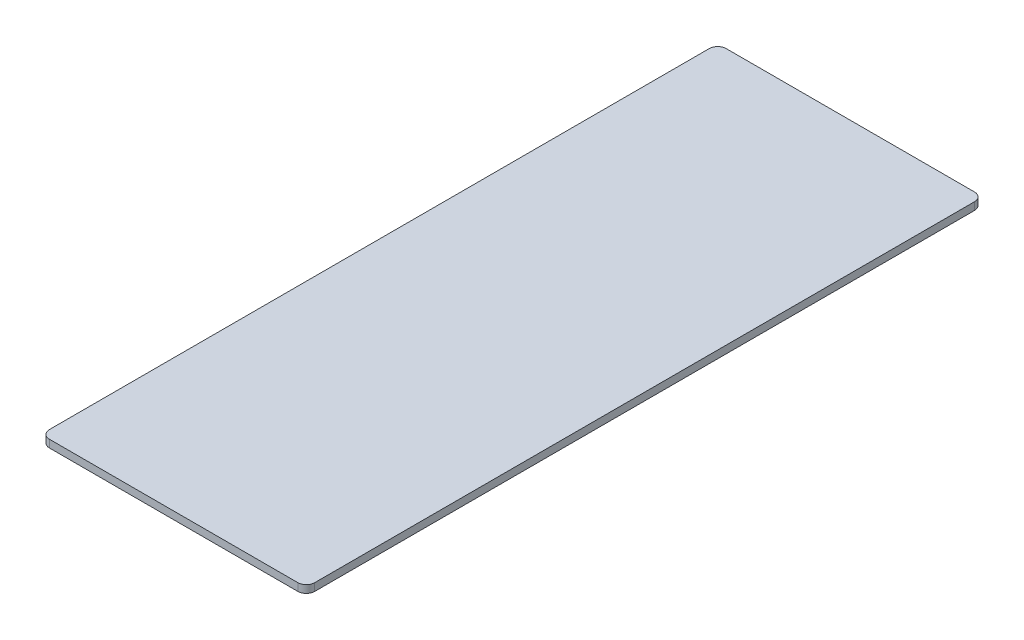
ISO-10303-21;
HEADER;
FILE_DESCRIPTION(('STEP AP214'),'2;1');
FILE_NAME('part.step','',(''),(''),'','','');
FILE_SCHEMA(('AUTOMOTIVE_DESIGN { 1 0 10303 214 1 1 1 1 }'));
ENDSEC;
DATA;
#1=APPLICATION_CONTEXT('core data for automotive mechanical design processes');
#2=APPLICATION_PROTOCOL_DEFINITION('international standard','automotive_design',2000,#1);
#3=PRODUCT_CONTEXT('',#1,'mechanical');
#4=PRODUCT('Part','Part','',(#3));
#5=PRODUCT_RELATED_PRODUCT_CATEGORY('part','',(#4));
#6=PRODUCT_DEFINITION_FORMATION('','',#4);
#7=PRODUCT_DEFINITION_CONTEXT('part definition',#1,'design');
#8=PRODUCT_DEFINITION('design','',#6,#7);
#9=PRODUCT_DEFINITION_SHAPE('','',#8);
#10=(LENGTH_UNIT() NAMED_UNIT(*) SI_UNIT(.MILLI.,.METRE.));
#11=(NAMED_UNIT(*) PLANE_ANGLE_UNIT() SI_UNIT($,.RADIAN.));
#12=(NAMED_UNIT(*) SI_UNIT($,.STERADIAN.) SOLID_ANGLE_UNIT());
#13=UNCERTAINTY_MEASURE_WITH_UNIT(LENGTH_MEASURE(1.E-05),#10,'distance_accuracy_value','');
#14=(GEOMETRIC_REPRESENTATION_CONTEXT(3) GLOBAL_UNCERTAINTY_ASSIGNED_CONTEXT((#13)) GLOBAL_UNIT_ASSIGNED_CONTEXT((#10,
#11,#12)) REPRESENTATION_CONTEXT('',''));
#15=CARTESIAN_POINT('',(0.,0.,0.));
#16=DIRECTION('',(0.,0.,1.));
#17=DIRECTION('',(1.,0.,0.));
#18=AXIS2_PLACEMENT_3D('',#15,#16,#17);
#19=CARTESIAN_POINT('',(0.,4.5,0.));
#20=DIRECTION('',(1.,0.,0.));
#21=DIRECTION('',(0.,0.,-1.));
#22=AXIS2_PLACEMENT_3D('',#19,#20,#21);
#23=PLANE('',#22);
#24=DIRECTION('',(0.,0.,1.));
#25=VECTOR('',#24,1.);
#26=CARTESIAN_POINT('',(0.,4.5,0.));
#27=LINE('',#26,#25);
#28=CARTESIAN_POINT('',(0.,4.5,-395.));
#29=VERTEX_POINT('',#28);
#30=CARTESIAN_POINT('',(0.,4.5,-5.));
#31=VERTEX_POINT('',#30);
#32=EDGE_CURVE('E131',#29,#31,#27,.T.);
#33=ORIENTED_EDGE('',*,*,#32,.F.);
#34=DIRECTION('',(0.,-1.,0.));
#35=VECTOR('',#34,1.);
#36=CARTESIAN_POINT('',(0.,4.5,-395.));
#37=LINE('',#36,#35);
#38=CARTESIAN_POINT('',(0.,0.,-395.));
#39=VERTEX_POINT('',#38);
#40=EDGE_CURVE('E115',#29,#39,#37,.T.);
#41=ORIENTED_EDGE('',*,*,#40,.T.);
#42=DIRECTION('',(0.,0.,1.));
#43=VECTOR('',#42,1.);
#44=CARTESIAN_POINT('',(0.,0.,0.));
#45=LINE('',#44,#43);
#46=CARTESIAN_POINT('',(0.,0.,-5.));
#47=VERTEX_POINT('',#46);
#48=EDGE_CURVE('E128',#39,#47,#45,.T.);
#49=ORIENTED_EDGE('',*,*,#48,.T.);
#50=DIRECTION('',(0.,-1.,0.));
#51=VECTOR('',#50,1.);
#52=CARTESIAN_POINT('',(0.,4.5,-5.));
#53=LINE('',#52,#51);
#54=EDGE_CURVE('E134',#47,#31,#53,.F.);
#55=ORIENTED_EDGE('',*,*,#54,.T.);
#56=EDGE_LOOP('',(#33,#41,#49,#55));
#57=FACE_BOUND('',#56,.T.);
#58=ADVANCED_FACE('F45',(#57),#23,.F.);
#59=CARTESIAN_POINT('',(0.,4.5,0.));
#60=DIRECTION('',(0.,0.,-1.));
#61=DIRECTION('',(-1.,0.,0.));
#62=AXIS2_PLACEMENT_3D('',#59,#60,#61);
#63=PLANE('',#62);
#64=DIRECTION('',(1.,0.,0.));
#65=VECTOR('',#64,1.);
#66=CARTESIAN_POINT('',(0.,4.5,0.));
#67=LINE('',#66,#65);
#68=CARTESIAN_POINT('',(5.,4.5,0.));
#69=VERTEX_POINT('',#68);
#70=CARTESIAN_POINT('',(151.8,4.5,0.));
#71=VERTEX_POINT('',#70);
#72=EDGE_CURVE('E202',#69,#71,#67,.T.);
#73=ORIENTED_EDGE('',*,*,#72,.F.);
#74=DIRECTION('',(0.,-1.,0.));
#75=VECTOR('',#74,1.);
#76=CARTESIAN_POINT('',(5.,4.5,0.));
#77=LINE('',#76,#75);
#78=CARTESIAN_POINT('',(5.,0.,0.));
#79=VERTEX_POINT('',#78);
#80=EDGE_CURVE('E182',#69,#79,#77,.T.);
#81=ORIENTED_EDGE('',*,*,#80,.T.);
#82=DIRECTION('',(1.,0.,0.));
#83=VECTOR('',#82,1.);
#84=CARTESIAN_POINT('',(0.,0.,0.));
#85=LINE('',#84,#83);
#86=CARTESIAN_POINT('',(151.8,0.,0.));
#87=VERTEX_POINT('',#86);
#88=EDGE_CURVE('E139',#79,#87,#85,.T.);
#89=ORIENTED_EDGE('',*,*,#88,.T.);
#90=DIRECTION('',(0.,-1.,0.));
#91=VECTOR('',#90,1.);
#92=CARTESIAN_POINT('',(151.8,4.5,0.));
#93=LINE('',#92,#91);
#94=EDGE_CURVE('E179',#87,#71,#93,.F.);
#95=ORIENTED_EDGE('',*,*,#94,.T.);
#96=EDGE_LOOP('',(#73,#81,#89,#95));
#97=FACE_BOUND('',#96,.T.);
#98=ADVANCED_FACE('F214',(#97),#63,.F.);
#99=CARTESIAN_POINT('',(156.8,4.5,0.));
#100=DIRECTION('',(-1.,0.,0.));
#101=DIRECTION('',(0.,0.,1.));
#102=AXIS2_PLACEMENT_3D('',#99,#100,#101);
#103=PLANE('',#102);
#104=DIRECTION('',(0.,0.,-1.));
#105=VECTOR('',#104,1.);
#106=CARTESIAN_POINT('',(156.8,0.,0.));
#107=LINE('',#106,#105);
#108=CARTESIAN_POINT('',(156.8,0.,-5.));
#109=VERTEX_POINT('',#108);
#110=CARTESIAN_POINT('',(156.8,0.,-395.));
#111=VERTEX_POINT('',#110);
#112=EDGE_CURVE('E143',#109,#111,#107,.T.);
#113=ORIENTED_EDGE('',*,*,#112,.T.);
#114=DIRECTION('',(0.,-1.,0.));
#115=VECTOR('',#114,1.);
#116=CARTESIAN_POINT('',(156.8,4.5,-395.));
#117=LINE('',#116,#115);
#118=CARTESIAN_POINT('',(156.8,4.5,-395.));
#119=VERTEX_POINT('',#118);
#120=EDGE_CURVE('E11',#111,#119,#117,.F.);
#121=ORIENTED_EDGE('',*,*,#120,.T.);
#122=DIRECTION('',(0.,0.,-1.));
#123=VECTOR('',#122,1.);
#124=CARTESIAN_POINT('',(156.8,4.5,0.));
#125=LINE('',#124,#123);
#126=CARTESIAN_POINT('',(156.8,4.5,-5.));
#127=VERTEX_POINT('',#126);
#128=EDGE_CURVE('E190',#127,#119,#125,.T.);
#129=ORIENTED_EDGE('',*,*,#128,.F.);
#130=DIRECTION('',(0.,-1.,0.));
#131=VECTOR('',#130,1.);
#132=CARTESIAN_POINT('',(156.8,4.5,-5.));
#133=LINE('',#132,#131);
#134=EDGE_CURVE('E54',#127,#109,#133,.T.);
#135=ORIENTED_EDGE('',*,*,#134,.T.);
#136=EDGE_LOOP('',(#113,#121,#129,#135));
#137=FACE_BOUND('',#136,.T.);
#138=ADVANCED_FACE('F189',(#137),#103,.F.);
#139=CARTESIAN_POINT('',(0.,4.5,-400.));
#140=DIRECTION('',(0.,0.,1.));
#141=DIRECTION('',(1.,0.,0.));
#142=AXIS2_PLACEMENT_3D('',#139,#140,#141);
#143=PLANE('',#142);
#144=DIRECTION('',(-1.,0.,0.));
#145=VECTOR('',#144,1.);
#146=CARTESIAN_POINT('',(0.,0.,-400.));
#147=LINE('',#146,#145);
#148=CARTESIAN_POINT('',(151.8,0.,-400.));
#149=VERTEX_POINT('',#148);
#150=CARTESIAN_POINT('',(5.,0.,-400.));
#151=VERTEX_POINT('',#150);
#152=EDGE_CURVE('E151',#149,#151,#147,.T.);
#153=ORIENTED_EDGE('',*,*,#152,.T.);
#154=DIRECTION('',(0.,-1.,0.));
#155=VECTOR('',#154,1.);
#156=CARTESIAN_POINT('',(5.,4.5,-400.));
#157=LINE('',#156,#155);
#158=CARTESIAN_POINT('',(5.,4.5,-400.));
#159=VERTEX_POINT('',#158);
#160=EDGE_CURVE('E116',#151,#159,#157,.F.);
#161=ORIENTED_EDGE('',*,*,#160,.T.);
#162=DIRECTION('',(-1.,0.,0.));
#163=VECTOR('',#162,1.);
#164=CARTESIAN_POINT('',(0.,4.5,-400.));
#165=LINE('',#164,#163);
#166=CARTESIAN_POINT('',(151.8,4.5,-400.));
#167=VERTEX_POINT('',#166);
#168=EDGE_CURVE('E146',#167,#159,#165,.T.);
#169=ORIENTED_EDGE('',*,*,#168,.F.);
#170=DIRECTION('',(0.,-1.,0.));
#171=VECTOR('',#170,1.);
#172=CARTESIAN_POINT('',(151.8,4.5,-400.));
#173=LINE('',#172,#171);
#174=EDGE_CURVE('E122',#167,#149,#173,.T.);
#175=ORIENTED_EDGE('',*,*,#174,.T.);
#176=EDGE_LOOP('',(#153,#161,#169,#175));
#177=FACE_BOUND('',#176,.T.);
#178=ADVANCED_FACE('F198',(#177),#143,.F.);
#179=CARTESIAN_POINT('',(0.,4.5,0.));
#180=DIRECTION('',(0.,-1.,0.));
#181=DIRECTION('',(0.,0.,-1.));
#182=AXIS2_PLACEMENT_3D('',#179,#180,#181);
#183=PLANE('',#182);
#184=ORIENTED_EDGE('',*,*,#168,.T.);
#185=CARTESIAN_POINT('',(5.,4.5,-395.));
#186=DIRECTION('',(0.,-1.,0.));
#187=DIRECTION('',(0.,0.,-1.));
#188=AXIS2_PLACEMENT_3D('',#185,#186,#187);
#189=CIRCLE('',#188,5.);
#190=EDGE_CURVE('E176',#159,#29,#189,.F.);
#191=ORIENTED_EDGE('',*,*,#190,.T.);
#192=ORIENTED_EDGE('',*,*,#32,.T.);
#193=CARTESIAN_POINT('',(5.,4.5,-5.));
#194=DIRECTION('',(0.,-1.,0.));
#195=DIRECTION('',(0.,0.,-1.));
#196=AXIS2_PLACEMENT_3D('',#193,#194,#195);
#197=CIRCLE('',#196,5.);
#198=EDGE_CURVE('E173',#31,#69,#197,.F.);
#199=ORIENTED_EDGE('',*,*,#198,.T.);
#200=ORIENTED_EDGE('',*,*,#72,.T.);
#201=CARTESIAN_POINT('',(151.8,4.5,-5.));
#202=DIRECTION('',(0.,-1.,0.));
#203=DIRECTION('',(0.,0.,-1.));
#204=AXIS2_PLACEMENT_3D('',#201,#202,#203);
#205=CIRCLE('',#204,5.);
#206=EDGE_CURVE('E66',#71,#127,#205,.F.);
#207=ORIENTED_EDGE('',*,*,#206,.T.);
#208=ORIENTED_EDGE('',*,*,#128,.T.);
#209=CARTESIAN_POINT('',(151.8,4.5,-395.));
#210=DIRECTION('',(0.,-1.,0.));
#211=DIRECTION('',(0.,0.,-1.));
#212=AXIS2_PLACEMENT_3D('',#209,#210,#211);
#213=CIRCLE('',#212,5.);
#214=EDGE_CURVE('E170',#119,#167,#213,.F.);
#215=ORIENTED_EDGE('',*,*,#214,.T.);
#216=EDGE_LOOP('',(#184,#191,#192,#199,#200,#207,#208,#215));
#217=FACE_BOUND('',#216,.T.);
#218=ADVANCED_FACE('F208',(#217),#183,.F.);
#219=CARTESIAN_POINT('',(0.,0.,0.));
#220=DIRECTION('',(0.,-1.,0.));
#221=DIRECTION('',(0.,0.,-1.));
#222=AXIS2_PLACEMENT_3D('',#219,#220,#221);
#223=PLANE('',#222);
#224=ORIENTED_EDGE('',*,*,#48,.F.);
#225=CARTESIAN_POINT('',(5.,0.,-395.));
#226=DIRECTION('',(0.,-1.,0.));
#227=DIRECTION('',(0.,0.,-1.));
#228=AXIS2_PLACEMENT_3D('',#225,#226,#227);
#229=CIRCLE('',#228,5.);
#230=EDGE_CURVE('E111',#39,#151,#229,.T.);
#231=ORIENTED_EDGE('',*,*,#230,.T.);
#232=ORIENTED_EDGE('',*,*,#152,.F.);
#233=CARTESIAN_POINT('',(151.8,0.,-395.));
#234=DIRECTION('',(0.,-1.,0.));
#235=DIRECTION('',(0.,0.,-1.));
#236=AXIS2_PLACEMENT_3D('',#233,#234,#235);
#237=CIRCLE('',#236,5.);
#238=EDGE_CURVE('E158',#149,#111,#237,.T.);
#239=ORIENTED_EDGE('',*,*,#238,.T.);
#240=ORIENTED_EDGE('',*,*,#112,.F.);
#241=CARTESIAN_POINT('',(151.8,0.,-5.));
#242=DIRECTION('',(0.,-1.,0.));
#243=DIRECTION('',(0.,0.,-1.));
#244=AXIS2_PLACEMENT_3D('',#241,#242,#243);
#245=CIRCLE('',#244,5.);
#246=EDGE_CURVE('E133',#109,#87,#245,.T.);
#247=ORIENTED_EDGE('',*,*,#246,.T.);
#248=ORIENTED_EDGE('',*,*,#88,.F.);
#249=CARTESIAN_POINT('',(5.,0.,-5.));
#250=DIRECTION('',(0.,-1.,0.));
#251=DIRECTION('',(0.,0.,-1.));
#252=AXIS2_PLACEMENT_3D('',#249,#250,#251);
#253=CIRCLE('',#252,5.);
#254=EDGE_CURVE('E123',#79,#47,#253,.T.);
#255=ORIENTED_EDGE('',*,*,#254,.T.);
#256=EDGE_LOOP('',(#224,#231,#232,#239,#240,#247,#248,#255));
#257=FACE_BOUND('',#256,.T.);
#258=ADVANCED_FACE('F136',(#257),#223,.T.);
#259=CARTESIAN_POINT('',(5.,4.5,-395.));
#260=DIRECTION('',(0.,-1.,0.));
#261=DIRECTION('',(0.,0.,-1.));
#262=AXIS2_PLACEMENT_3D('',#259,#260,#261);
#263=CYLINDRICAL_SURFACE('',#262,5.);
#264=ORIENTED_EDGE('',*,*,#190,.F.);
#265=ORIENTED_EDGE('',*,*,#160,.F.);
#266=ORIENTED_EDGE('',*,*,#230,.F.);
#267=ORIENTED_EDGE('',*,*,#40,.F.);
#268=EDGE_LOOP('',(#264,#265,#266,#267));
#269=FACE_BOUND('',#268,.T.);
#270=ADVANCED_FACE('F114',(#269),#263,.T.);
#271=CARTESIAN_POINT('',(5.,4.5,-5.));
#272=DIRECTION('',(0.,-1.,0.));
#273=DIRECTION('',(0.,0.,-1.));
#274=AXIS2_PLACEMENT_3D('',#271,#272,#273);
#275=CYLINDRICAL_SURFACE('',#274,5.);
#276=ORIENTED_EDGE('',*,*,#198,.F.);
#277=ORIENTED_EDGE('',*,*,#54,.F.);
#278=ORIENTED_EDGE('',*,*,#254,.F.);
#279=ORIENTED_EDGE('',*,*,#80,.F.);
#280=EDGE_LOOP('',(#276,#277,#278,#279));
#281=FACE_BOUND('',#280,.T.);
#282=ADVANCED_FACE('F212',(#281),#275,.T.);
#283=CARTESIAN_POINT('',(151.8,4.5,-395.));
#284=DIRECTION('',(0.,-1.,0.));
#285=DIRECTION('',(0.,0.,-1.));
#286=AXIS2_PLACEMENT_3D('',#283,#284,#285);
#287=CYLINDRICAL_SURFACE('',#286,5.);
#288=ORIENTED_EDGE('',*,*,#214,.F.);
#289=ORIENTED_EDGE('',*,*,#120,.F.);
#290=ORIENTED_EDGE('',*,*,#238,.F.);
#291=ORIENTED_EDGE('',*,*,#174,.F.);
#292=EDGE_LOOP('',(#288,#289,#290,#291));
#293=FACE_BOUND('',#292,.T.);
#294=ADVANCED_FACE('F195',(#293),#287,.T.);
#295=CARTESIAN_POINT('',(151.8,4.5,-5.));
#296=DIRECTION('',(0.,-1.,0.));
#297=DIRECTION('',(0.,0.,-1.));
#298=AXIS2_PLACEMENT_3D('',#295,#296,#297);
#299=CYLINDRICAL_SURFACE('',#298,5.);
#300=ORIENTED_EDGE('',*,*,#206,.F.);
#301=ORIENTED_EDGE('',*,*,#94,.F.);
#302=ORIENTED_EDGE('',*,*,#246,.F.);
#303=ORIENTED_EDGE('',*,*,#134,.F.);
#304=EDGE_LOOP('',(#300,#301,#302,#303));
#305=FACE_BOUND('',#304,.T.);
#306=ADVANCED_FACE('F47',(#305),#299,.T.);
#307=CLOSED_SHELL('',(#58,#98,#138,#178,#218,#258,#270,#282,#294,#306));
#308=MANIFOLD_SOLID_BREP('B2',#307);
#309=ADVANCED_BREP_SHAPE_REPRESENTATION('',(#18,#308),#14);
#310=SHAPE_DEFINITION_REPRESENTATION(#9,#309);
ENDSEC;
END-ISO-10303-21;
